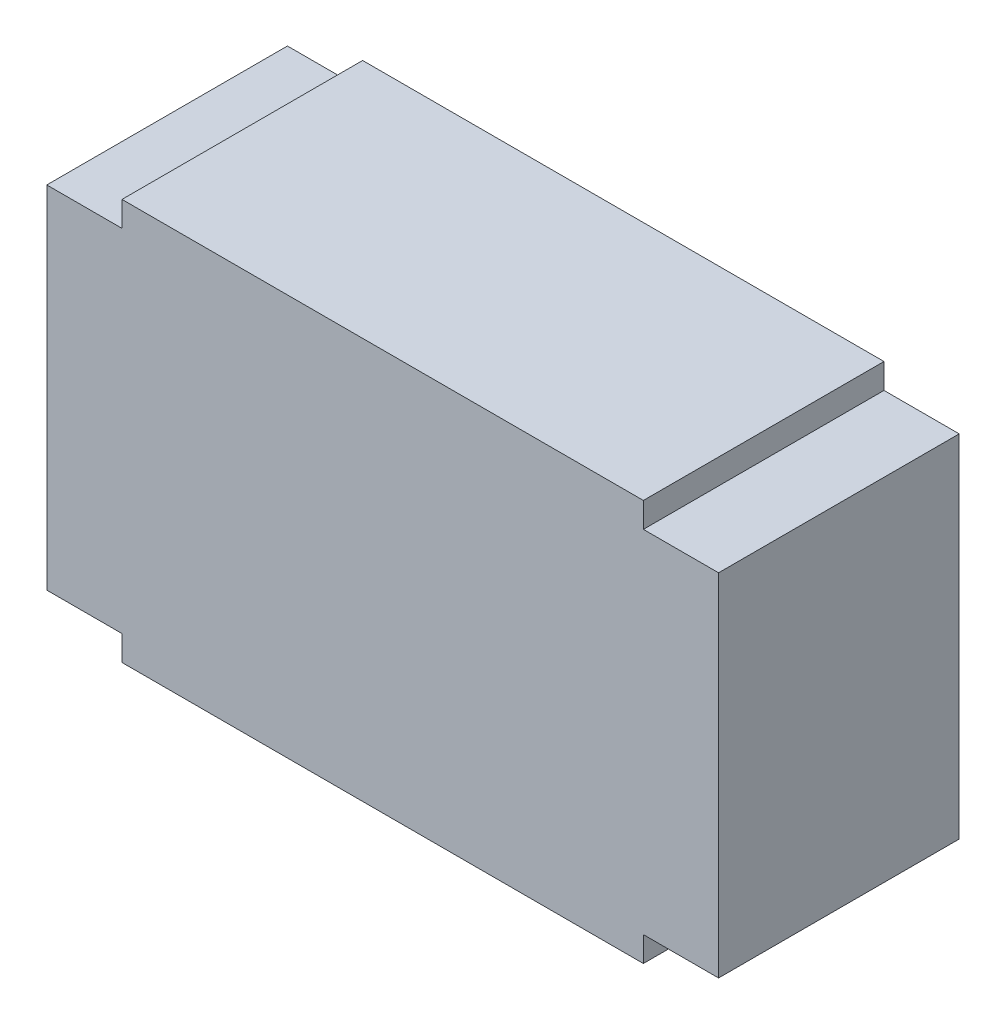
ISO-10303-21;
HEADER;
FILE_DESCRIPTION(('STEP AP214'),'2;1');
FILE_NAME('part.step','',(''),(''),'','','');
FILE_SCHEMA(('AUTOMOTIVE_DESIGN { 1 0 10303 214 1 1 1 1 }'));
ENDSEC;
DATA;
#1=APPLICATION_CONTEXT('core data for automotive mechanical design processes');
#2=APPLICATION_PROTOCOL_DEFINITION('international standard','automotive_design',2000,#1);
#3=PRODUCT_CONTEXT('',#1,'mechanical');
#4=PRODUCT('Part','Part','',(#3));
#5=PRODUCT_RELATED_PRODUCT_CATEGORY('part','',(#4));
#6=PRODUCT_DEFINITION_FORMATION('','',#4);
#7=PRODUCT_DEFINITION_CONTEXT('part definition',#1,'design');
#8=PRODUCT_DEFINITION('design','',#6,#7);
#9=PRODUCT_DEFINITION_SHAPE('','',#8);
#10=(LENGTH_UNIT() NAMED_UNIT(*) SI_UNIT(.MILLI.,.METRE.));
#11=(NAMED_UNIT(*) PLANE_ANGLE_UNIT() SI_UNIT($,.RADIAN.));
#12=(NAMED_UNIT(*) SI_UNIT($,.STERADIAN.) SOLID_ANGLE_UNIT());
#13=UNCERTAINTY_MEASURE_WITH_UNIT(LENGTH_MEASURE(1.E-05),#10,'distance_accuracy_value','');
#14=(GEOMETRIC_REPRESENTATION_CONTEXT(3) GLOBAL_UNCERTAINTY_ASSIGNED_CONTEXT((#13)) GLOBAL_UNIT_ASSIGNED_CONTEXT((#10,
#11,#12)) REPRESENTATION_CONTEXT('',''));
#15=CARTESIAN_POINT('',(0.,0.,0.));
#16=DIRECTION('',(0.,0.,1.));
#17=DIRECTION('',(1.,0.,0.));
#18=AXIS2_PLACEMENT_3D('',#15,#16,#17);
#19=CARTESIAN_POINT('',(1.3,-1.,1.2));
#20=DIRECTION('',(0.,1.,0.));
#21=DIRECTION('',(0.,0.,1.));
#22=AXIS2_PLACEMENT_3D('',#19,#20,#21);
#23=PLANE('',#22);
#24=DIRECTION('',(1.,0.,0.));
#25=VECTOR('',#24,1.);
#26=CARTESIAN_POINT('',(1.3,-1.,0.));
#27=LINE('',#26,#25);
#28=CARTESIAN_POINT('',(-1.3,-1.,0.));
#29=VERTEX_POINT('',#28);
#30=CARTESIAN_POINT('',(1.3,-1.,0.));
#31=VERTEX_POINT('',#30);
#32=EDGE_CURVE('E154',#29,#31,#27,.T.);
#33=ORIENTED_EDGE('',*,*,#32,.T.);
#34=DIRECTION('',(0.,0.,-1.));
#35=VECTOR('',#34,1.);
#36=CARTESIAN_POINT('',(1.3,-1.,1.2));
#37=LINE('',#36,#35);
#38=CARTESIAN_POINT('',(1.3,-1.,1.2));
#39=VERTEX_POINT('',#38);
#40=EDGE_CURVE('E11',#39,#31,#37,.T.);
#41=ORIENTED_EDGE('',*,*,#40,.F.);
#42=DIRECTION('',(1.,0.,0.));
#43=VECTOR('',#42,1.);
#44=CARTESIAN_POINT('',(1.3,-1.,1.2));
#45=LINE('',#44,#43);
#46=CARTESIAN_POINT('',(-1.3,-1.,1.2));
#47=VERTEX_POINT('',#46);
#48=EDGE_CURVE('E176',#47,#39,#45,.T.);
#49=ORIENTED_EDGE('',*,*,#48,.F.);
#50=DIRECTION('',(0.,0.,-1.));
#51=VECTOR('',#50,1.);
#52=CARTESIAN_POINT('',(-1.3,-1.,1.2));
#53=LINE('',#52,#51);
#54=EDGE_CURVE('E150',#47,#29,#53,.T.);
#55=ORIENTED_EDGE('',*,*,#54,.T.);
#56=EDGE_LOOP('',(#33,#41,#49,#55));
#57=FACE_BOUND('',#56,.T.);
#58=ADVANCED_FACE('F34',(#57),#23,.F.);
#59=CARTESIAN_POINT('',(1.3,-0.875,1.2));
#60=DIRECTION('',(-1.,0.,0.));
#61=DIRECTION('',(0.,0.,1.));
#62=AXIS2_PLACEMENT_3D('',#59,#60,#61);
#63=PLANE('',#62);
#64=DIRECTION('',(0.,1.,0.));
#65=VECTOR('',#64,1.);
#66=CARTESIAN_POINT('',(1.3,-0.875,0.));
#67=LINE('',#66,#65);
#68=CARTESIAN_POINT('',(1.3,-0.875,0.));
#69=VERTEX_POINT('',#68);
#70=EDGE_CURVE('E157',#31,#69,#67,.T.);
#71=ORIENTED_EDGE('',*,*,#70,.T.);
#72=DIRECTION('',(0.,0.,-1.));
#73=VECTOR('',#72,1.);
#74=CARTESIAN_POINT('',(1.3,-0.875,1.2));
#75=LINE('',#74,#73);
#76=CARTESIAN_POINT('',(1.3,-0.875,1.2));
#77=VERTEX_POINT('',#76);
#78=EDGE_CURVE('E42',#77,#69,#75,.T.);
#79=ORIENTED_EDGE('',*,*,#78,.F.);
#80=DIRECTION('',(0.,1.,0.));
#81=VECTOR('',#80,1.);
#82=CARTESIAN_POINT('',(1.3,-0.875,1.2));
#83=LINE('',#82,#81);
#84=EDGE_CURVE('E105',#39,#77,#83,.T.);
#85=ORIENTED_EDGE('',*,*,#84,.F.);
#86=ORIENTED_EDGE('',*,*,#40,.T.);
#87=EDGE_LOOP('',(#71,#79,#85,#86));
#88=FACE_BOUND('',#87,.T.);
#89=ADVANCED_FACE('F254',(#88),#63,.F.);
#90=CARTESIAN_POINT('',(1.675,-0.875,1.2));
#91=DIRECTION('',(0.,1.,0.));
#92=DIRECTION('',(0.,0.,1.));
#93=AXIS2_PLACEMENT_3D('',#90,#91,#92);
#94=PLANE('',#93);
#95=DIRECTION('',(1.,0.,0.));
#96=VECTOR('',#95,1.);
#97=CARTESIAN_POINT('',(1.675,-0.875,0.));
#98=LINE('',#97,#96);
#99=CARTESIAN_POINT('',(1.675,-0.875,0.));
#100=VERTEX_POINT('',#99);
#101=EDGE_CURVE('E159',#69,#100,#98,.T.);
#102=ORIENTED_EDGE('',*,*,#101,.T.);
#103=DIRECTION('',(0.,0.,-1.));
#104=VECTOR('',#103,1.);
#105=CARTESIAN_POINT('',(1.675,-0.875,1.2));
#106=LINE('',#105,#104);
#107=CARTESIAN_POINT('',(1.675,-0.875,1.2));
#108=VERTEX_POINT('',#107);
#109=EDGE_CURVE('E195',#108,#100,#106,.T.);
#110=ORIENTED_EDGE('',*,*,#109,.F.);
#111=DIRECTION('',(1.,0.,0.));
#112=VECTOR('',#111,1.);
#113=CARTESIAN_POINT('',(1.675,-0.875,1.2));
#114=LINE('',#113,#112);
#115=EDGE_CURVE('E203',#77,#108,#114,.T.);
#116=ORIENTED_EDGE('',*,*,#115,.F.);
#117=ORIENTED_EDGE('',*,*,#78,.T.);
#118=EDGE_LOOP('',(#102,#110,#116,#117));
#119=FACE_BOUND('',#118,.T.);
#120=ADVANCED_FACE('F201',(#119),#94,.F.);
#121=CARTESIAN_POINT('',(1.675,0.875,1.2));
#122=DIRECTION('',(-1.,0.,0.));
#123=DIRECTION('',(0.,0.,1.));
#124=AXIS2_PLACEMENT_3D('',#121,#122,#123);
#125=PLANE('',#124);
#126=DIRECTION('',(0.,1.,0.));
#127=VECTOR('',#126,1.);
#128=CARTESIAN_POINT('',(1.675,0.875,0.));
#129=LINE('',#128,#127);
#130=CARTESIAN_POINT('',(1.675,0.875,0.));
#131=VERTEX_POINT('',#130);
#132=EDGE_CURVE('E161',#100,#131,#129,.T.);
#133=ORIENTED_EDGE('',*,*,#132,.T.);
#134=DIRECTION('',(0.,0.,-1.));
#135=VECTOR('',#134,1.);
#136=CARTESIAN_POINT('',(1.675,0.875,1.2));
#137=LINE('',#136,#135);
#138=CARTESIAN_POINT('',(1.675,0.875,1.2));
#139=VERTEX_POINT('',#138);
#140=EDGE_CURVE('E192',#139,#131,#137,.T.);
#141=ORIENTED_EDGE('',*,*,#140,.F.);
#142=DIRECTION('',(0.,1.,0.));
#143=VECTOR('',#142,1.);
#144=CARTESIAN_POINT('',(1.675,0.875,1.2));
#145=LINE('',#144,#143);
#146=EDGE_CURVE('E221',#108,#139,#145,.T.);
#147=ORIENTED_EDGE('',*,*,#146,.F.);
#148=ORIENTED_EDGE('',*,*,#109,.T.);
#149=EDGE_LOOP('',(#133,#141,#147,#148));
#150=FACE_BOUND('',#149,.T.);
#151=ADVANCED_FACE('F212',(#150),#125,.F.);
#152=CARTESIAN_POINT('',(1.3,0.875,1.2));
#153=DIRECTION('',(0.,-1.,0.));
#154=DIRECTION('',(0.,0.,-1.));
#155=AXIS2_PLACEMENT_3D('',#152,#153,#154);
#156=PLANE('',#155);
#157=DIRECTION('',(-1.,0.,0.));
#158=VECTOR('',#157,1.);
#159=CARTESIAN_POINT('',(1.3,0.875,0.));
#160=LINE('',#159,#158);
#161=CARTESIAN_POINT('',(1.3,0.875,0.));
#162=VERTEX_POINT('',#161);
#163=EDGE_CURVE('E163',#131,#162,#160,.T.);
#164=ORIENTED_EDGE('',*,*,#163,.T.);
#165=DIRECTION('',(0.,0.,-1.));
#166=VECTOR('',#165,1.);
#167=CARTESIAN_POINT('',(1.3,0.875,1.2));
#168=LINE('',#167,#166);
#169=CARTESIAN_POINT('',(1.3,0.875,1.2));
#170=VERTEX_POINT('',#169);
#171=EDGE_CURVE('E189',#170,#162,#168,.T.);
#172=ORIENTED_EDGE('',*,*,#171,.F.);
#173=DIRECTION('',(-1.,0.,0.));
#174=VECTOR('',#173,1.);
#175=CARTESIAN_POINT('',(1.3,0.875,1.2));
#176=LINE('',#175,#174);
#177=EDGE_CURVE('E218',#139,#170,#176,.T.);
#178=ORIENTED_EDGE('',*,*,#177,.F.);
#179=ORIENTED_EDGE('',*,*,#140,.T.);
#180=EDGE_LOOP('',(#164,#172,#178,#179));
#181=FACE_BOUND('',#180,.T.);
#182=ADVANCED_FACE('F216',(#181),#156,.F.);
#183=CARTESIAN_POINT('',(1.3,1.,1.2));
#184=DIRECTION('',(-1.,0.,0.));
#185=DIRECTION('',(0.,0.,1.));
#186=AXIS2_PLACEMENT_3D('',#183,#184,#185);
#187=PLANE('',#186);
#188=DIRECTION('',(0.,1.,0.));
#189=VECTOR('',#188,1.);
#190=CARTESIAN_POINT('',(1.3,1.,0.));
#191=LINE('',#190,#189);
#192=CARTESIAN_POINT('',(1.3,1.,0.));
#193=VERTEX_POINT('',#192);
#194=EDGE_CURVE('E165',#162,#193,#191,.T.);
#195=ORIENTED_EDGE('',*,*,#194,.T.);
#196=DIRECTION('',(0.,0.,-1.));
#197=VECTOR('',#196,1.);
#198=CARTESIAN_POINT('',(1.3,1.,1.2));
#199=LINE('',#198,#197);
#200=CARTESIAN_POINT('',(1.3,1.,1.2));
#201=VERTEX_POINT('',#200);
#202=EDGE_CURVE('E186',#201,#193,#199,.T.);
#203=ORIENTED_EDGE('',*,*,#202,.F.);
#204=DIRECTION('',(0.,1.,0.));
#205=VECTOR('',#204,1.);
#206=CARTESIAN_POINT('',(1.3,1.,1.2));
#207=LINE('',#206,#205);
#208=EDGE_CURVE('E220',#170,#201,#207,.T.);
#209=ORIENTED_EDGE('',*,*,#208,.F.);
#210=ORIENTED_EDGE('',*,*,#171,.T.);
#211=EDGE_LOOP('',(#195,#203,#209,#210));
#212=FACE_BOUND('',#211,.T.);
#213=ADVANCED_FACE('F267',(#212),#187,.F.);
#214=CARTESIAN_POINT('',(-1.3,1.,1.2));
#215=DIRECTION('',(0.,-1.,0.));
#216=DIRECTION('',(0.,0.,-1.));
#217=AXIS2_PLACEMENT_3D('',#214,#215,#216);
#218=PLANE('',#217);
#219=DIRECTION('',(-1.,0.,0.));
#220=VECTOR('',#219,1.);
#221=CARTESIAN_POINT('',(-1.3,1.,0.));
#222=LINE('',#221,#220);
#223=CARTESIAN_POINT('',(-1.3,1.,0.));
#224=VERTEX_POINT('',#223);
#225=EDGE_CURVE('E167',#193,#224,#222,.T.);
#226=ORIENTED_EDGE('',*,*,#225,.T.);
#227=DIRECTION('',(0.,0.,-1.));
#228=VECTOR('',#227,1.);
#229=CARTESIAN_POINT('',(-1.3,1.,1.2));
#230=LINE('',#229,#228);
#231=CARTESIAN_POINT('',(-1.3,1.,1.2));
#232=VERTEX_POINT('',#231);
#233=EDGE_CURVE('E183',#232,#224,#230,.T.);
#234=ORIENTED_EDGE('',*,*,#233,.F.);
#235=DIRECTION('',(-1.,0.,0.));
#236=VECTOR('',#235,1.);
#237=CARTESIAN_POINT('',(-1.3,1.,1.2));
#238=LINE('',#237,#236);
#239=EDGE_CURVE('E223',#201,#232,#238,.T.);
#240=ORIENTED_EDGE('',*,*,#239,.F.);
#241=ORIENTED_EDGE('',*,*,#202,.T.);
#242=EDGE_LOOP('',(#226,#234,#240,#241));
#243=FACE_BOUND('',#242,.T.);
#244=ADVANCED_FACE('F270',(#243),#218,.F.);
#245=CARTESIAN_POINT('',(-1.3,0.875,1.2));
#246=DIRECTION('',(1.,0.,0.));
#247=DIRECTION('',(0.,0.,-1.));
#248=AXIS2_PLACEMENT_3D('',#245,#246,#247);
#249=PLANE('',#248);
#250=DIRECTION('',(0.,-1.,0.));
#251=VECTOR('',#250,1.);
#252=CARTESIAN_POINT('',(-1.3,0.875,0.));
#253=LINE('',#252,#251);
#254=CARTESIAN_POINT('',(-1.3,0.875,0.));
#255=VERTEX_POINT('',#254);
#256=EDGE_CURVE('E169',#224,#255,#253,.T.);
#257=ORIENTED_EDGE('',*,*,#256,.T.);
#258=DIRECTION('',(0.,0.,-1.));
#259=VECTOR('',#258,1.);
#260=CARTESIAN_POINT('',(-1.3,0.875,1.2));
#261=LINE('',#260,#259);
#262=CARTESIAN_POINT('',(-1.3,0.875,1.2));
#263=VERTEX_POINT('',#262);
#264=EDGE_CURVE('E180',#263,#255,#261,.T.);
#265=ORIENTED_EDGE('',*,*,#264,.F.);
#266=DIRECTION('',(0.,-1.,0.));
#267=VECTOR('',#266,1.);
#268=CARTESIAN_POINT('',(-1.3,0.875,1.2));
#269=LINE('',#268,#267);
#270=EDGE_CURVE('E229',#232,#263,#269,.T.);
#271=ORIENTED_EDGE('',*,*,#270,.F.);
#272=ORIENTED_EDGE('',*,*,#233,.T.);
#273=EDGE_LOOP('',(#257,#265,#271,#272));
#274=FACE_BOUND('',#273,.T.);
#275=ADVANCED_FACE('F235',(#274),#249,.F.);
#276=CARTESIAN_POINT('',(-1.675,0.875,1.2));
#277=DIRECTION('',(0.,-1.,0.));
#278=DIRECTION('',(0.,0.,-1.));
#279=AXIS2_PLACEMENT_3D('',#276,#277,#278);
#280=PLANE('',#279);
#281=DIRECTION('',(-1.,0.,0.));
#282=VECTOR('',#281,1.);
#283=CARTESIAN_POINT('',(-1.675,0.875,0.));
#284=LINE('',#283,#282);
#285=CARTESIAN_POINT('',(-1.675,0.875,0.));
#286=VERTEX_POINT('',#285);
#287=EDGE_CURVE('E171',#255,#286,#284,.T.);
#288=ORIENTED_EDGE('',*,*,#287,.T.);
#289=DIRECTION('',(0.,0.,-1.));
#290=VECTOR('',#289,1.);
#291=CARTESIAN_POINT('',(-1.675,0.875,1.2));
#292=LINE('',#291,#290);
#293=CARTESIAN_POINT('',(-1.675,0.875,1.2));
#294=VERTEX_POINT('',#293);
#295=EDGE_CURVE('E145',#294,#286,#292,.T.);
#296=ORIENTED_EDGE('',*,*,#295,.F.);
#297=DIRECTION('',(-1.,0.,0.));
#298=VECTOR('',#297,1.);
#299=CARTESIAN_POINT('',(-1.675,0.875,1.2));
#300=LINE('',#299,#298);
#301=EDGE_CURVE('E136',#263,#294,#300,.T.);
#302=ORIENTED_EDGE('',*,*,#301,.F.);
#303=ORIENTED_EDGE('',*,*,#264,.T.);
#304=EDGE_LOOP('',(#288,#296,#302,#303));
#305=FACE_BOUND('',#304,.T.);
#306=ADVANCED_FACE('F239',(#305),#280,.F.);
#307=CARTESIAN_POINT('',(-1.675,-0.875,1.2));
#308=DIRECTION('',(1.,0.,0.));
#309=DIRECTION('',(0.,0.,-1.));
#310=AXIS2_PLACEMENT_3D('',#307,#308,#309);
#311=PLANE('',#310);
#312=DIRECTION('',(0.,-1.,0.));
#313=VECTOR('',#312,1.);
#314=CARTESIAN_POINT('',(-1.675,-0.875,0.));
#315=LINE('',#314,#313);
#316=CARTESIAN_POINT('',(-1.675,-0.875,0.));
#317=VERTEX_POINT('',#316);
#318=EDGE_CURVE('E144',#286,#317,#315,.T.);
#319=ORIENTED_EDGE('',*,*,#318,.T.);
#320=DIRECTION('',(0.,0.,-1.));
#321=VECTOR('',#320,1.);
#322=CARTESIAN_POINT('',(-1.675,-0.875,1.2));
#323=LINE('',#322,#321);
#324=CARTESIAN_POINT('',(-1.675,-0.875,1.2));
#325=VERTEX_POINT('',#324);
#326=EDGE_CURVE('E141',#325,#317,#323,.T.);
#327=ORIENTED_EDGE('',*,*,#326,.F.);
#328=DIRECTION('',(0.,-1.,0.));
#329=VECTOR('',#328,1.);
#330=CARTESIAN_POINT('',(-1.675,-0.875,1.2));
#331=LINE('',#330,#329);
#332=EDGE_CURVE('E130',#294,#325,#331,.T.);
#333=ORIENTED_EDGE('',*,*,#332,.F.);
#334=ORIENTED_EDGE('',*,*,#295,.T.);
#335=EDGE_LOOP('',(#319,#327,#333,#334));
#336=FACE_BOUND('',#335,.T.);
#337=ADVANCED_FACE('F142',(#336),#311,.F.);
#338=CARTESIAN_POINT('',(-1.3,-0.875,1.2));
#339=DIRECTION('',(0.,1.,0.));
#340=DIRECTION('',(0.,0.,1.));
#341=AXIS2_PLACEMENT_3D('',#338,#339,#340);
#342=PLANE('',#341);
#343=DIRECTION('',(1.,0.,0.));
#344=VECTOR('',#343,1.);
#345=CARTESIAN_POINT('',(-1.3,-0.875,0.));
#346=LINE('',#345,#344);
#347=CARTESIAN_POINT('',(-1.3,-0.875,0.));
#348=VERTEX_POINT('',#347);
#349=EDGE_CURVE('E91',#317,#348,#346,.T.);
#350=ORIENTED_EDGE('',*,*,#349,.T.);
#351=DIRECTION('',(0.,0.,-1.));
#352=VECTOR('',#351,1.);
#353=CARTESIAN_POINT('',(-1.3,-0.875,1.2));
#354=LINE('',#353,#352);
#355=CARTESIAN_POINT('',(-1.3,-0.875,1.2));
#356=VERTEX_POINT('',#355);
#357=EDGE_CURVE('E146',#356,#348,#354,.T.);
#358=ORIENTED_EDGE('',*,*,#357,.F.);
#359=DIRECTION('',(1.,0.,0.));
#360=VECTOR('',#359,1.);
#361=CARTESIAN_POINT('',(-1.3,-0.875,1.2));
#362=LINE('',#361,#360);
#363=EDGE_CURVE('E134',#325,#356,#362,.T.);
#364=ORIENTED_EDGE('',*,*,#363,.F.);
#365=ORIENTED_EDGE('',*,*,#326,.T.);
#366=EDGE_LOOP('',(#350,#358,#364,#365));
#367=FACE_BOUND('',#366,.T.);
#368=ADVANCED_FACE('F148',(#367),#342,.F.);
#369=CARTESIAN_POINT('',(-1.3,-1.,1.2));
#370=DIRECTION('',(1.,0.,0.));
#371=DIRECTION('',(0.,0.,-1.));
#372=AXIS2_PLACEMENT_3D('',#369,#370,#371);
#373=PLANE('',#372);
#374=DIRECTION('',(0.,-1.,0.));
#375=VECTOR('',#374,1.);
#376=CARTESIAN_POINT('',(-1.3,-1.,0.));
#377=LINE('',#376,#375);
#378=EDGE_CURVE('E97',#348,#29,#377,.T.);
#379=ORIENTED_EDGE('',*,*,#378,.T.);
#380=ORIENTED_EDGE('',*,*,#54,.F.);
#381=DIRECTION('',(0.,-1.,0.));
#382=VECTOR('',#381,1.);
#383=CARTESIAN_POINT('',(-1.3,-1.,1.2));
#384=LINE('',#383,#382);
#385=EDGE_CURVE('E50',#356,#47,#384,.T.);
#386=ORIENTED_EDGE('',*,*,#385,.F.);
#387=ORIENTED_EDGE('',*,*,#357,.T.);
#388=EDGE_LOOP('',(#379,#380,#386,#387));
#389=FACE_BOUND('',#388,.T.);
#390=ADVANCED_FACE('F243',(#389),#373,.F.);
#391=CARTESIAN_POINT('',(0.,0.,1.2));
#392=DIRECTION('',(0.,0.,-1.));
#393=DIRECTION('',(-1.,0.,0.));
#394=AXIS2_PLACEMENT_3D('',#391,#392,#393);
#395=PLANE('',#394);
#396=ORIENTED_EDGE('',*,*,#48,.T.);
#397=ORIENTED_EDGE('',*,*,#84,.T.);
#398=ORIENTED_EDGE('',*,*,#115,.T.);
#399=ORIENTED_EDGE('',*,*,#146,.T.);
#400=ORIENTED_EDGE('',*,*,#177,.T.);
#401=ORIENTED_EDGE('',*,*,#208,.T.);
#402=ORIENTED_EDGE('',*,*,#239,.T.);
#403=ORIENTED_EDGE('',*,*,#270,.T.);
#404=ORIENTED_EDGE('',*,*,#301,.T.);
#405=ORIENTED_EDGE('',*,*,#332,.T.);
#406=ORIENTED_EDGE('',*,*,#363,.T.);
#407=ORIENTED_EDGE('',*,*,#385,.T.);
#408=EDGE_LOOP('',(#396,#397,#398,#399,#400,#401,#402,#403,#404,#405,#406,#407));
#409=FACE_BOUND('',#408,.T.);
#410=ADVANCED_FACE('F132',(#409),#395,.F.);
#411=CARTESIAN_POINT('',(0.,0.,0.));
#412=DIRECTION('',(0.,0.,-1.));
#413=DIRECTION('',(-1.,0.,0.));
#414=AXIS2_PLACEMENT_3D('',#411,#412,#413);
#415=PLANE('',#414);
#416=ORIENTED_EDGE('',*,*,#32,.F.);
#417=ORIENTED_EDGE('',*,*,#378,.F.);
#418=ORIENTED_EDGE('',*,*,#349,.F.);
#419=ORIENTED_EDGE('',*,*,#318,.F.);
#420=ORIENTED_EDGE('',*,*,#287,.F.);
#421=ORIENTED_EDGE('',*,*,#256,.F.);
#422=ORIENTED_EDGE('',*,*,#225,.F.);
#423=ORIENTED_EDGE('',*,*,#194,.F.);
#424=ORIENTED_EDGE('',*,*,#163,.F.);
#425=ORIENTED_EDGE('',*,*,#132,.F.);
#426=ORIENTED_EDGE('',*,*,#101,.F.);
#427=ORIENTED_EDGE('',*,*,#70,.F.);
#428=EDGE_LOOP('',(#416,#417,#418,#419,#420,#421,#422,#423,#424,#425,#426,#427));
#429=FACE_BOUND('',#428,.T.);
#430=ADVANCED_FACE('F207',(#429),#415,.T.);
#431=CLOSED_SHELL('',(#58,#89,#120,#151,#182,#213,#244,#275,#306,#337,#368,#390,#410,#430));
#432=MANIFOLD_SOLID_BREP('B2',#431);
#433=ADVANCED_BREP_SHAPE_REPRESENTATION('',(#18,#432),#14);
#434=SHAPE_DEFINITION_REPRESENTATION(#9,#433);
ENDSEC;
END-ISO-10303-21;
